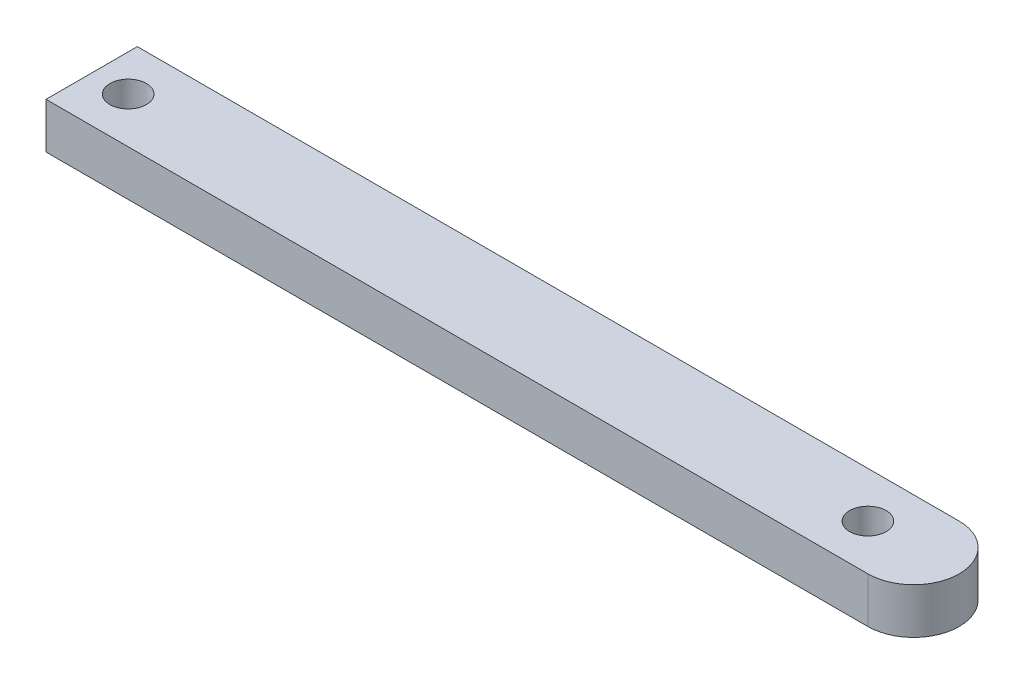
ISO-10303-21;
HEADER;
FILE_DESCRIPTION(('STEP AP214'),'2;1');
FILE_NAME('part.step','',(''),(''),'','','');
FILE_SCHEMA(('AUTOMOTIVE_DESIGN { 1 0 10303 214 1 1 1 1 }'));
ENDSEC;
DATA;
#1=APPLICATION_CONTEXT('core data for automotive mechanical design processes');
#2=APPLICATION_PROTOCOL_DEFINITION('international standard','automotive_design',2000,#1);
#3=PRODUCT_CONTEXT('',#1,'mechanical');
#4=PRODUCT('Part','Part','',(#3));
#5=PRODUCT_RELATED_PRODUCT_CATEGORY('part','',(#4));
#6=PRODUCT_DEFINITION_FORMATION('','',#4);
#7=PRODUCT_DEFINITION_CONTEXT('part definition',#1,'design');
#8=PRODUCT_DEFINITION('design','',#6,#7);
#9=PRODUCT_DEFINITION_SHAPE('','',#8);
#10=(LENGTH_UNIT() NAMED_UNIT(*) SI_UNIT(.MILLI.,.METRE.));
#11=(NAMED_UNIT(*) PLANE_ANGLE_UNIT() SI_UNIT($,.RADIAN.));
#12=(NAMED_UNIT(*) SI_UNIT($,.STERADIAN.) SOLID_ANGLE_UNIT());
#13=UNCERTAINTY_MEASURE_WITH_UNIT(LENGTH_MEASURE(1.E-05),#10,'distance_accuracy_value','');
#14=(GEOMETRIC_REPRESENTATION_CONTEXT(3) GLOBAL_UNCERTAINTY_ASSIGNED_CONTEXT((#13)) GLOBAL_UNIT_ASSIGNED_CONTEXT((#10,
#11,#12)) REPRESENTATION_CONTEXT('',''));
#15=CARTESIAN_POINT('',(0.,0.,0.));
#16=DIRECTION('',(0.,0.,1.));
#17=DIRECTION('',(1.,0.,0.));
#18=AXIS2_PLACEMENT_3D('',#15,#16,#17);
#19=CARTESIAN_POINT('',(0.,5.,-10.));
#20=DIRECTION('',(0.,0.,-1.));
#21=DIRECTION('',(-1.,0.,0.));
#22=AXIS2_PLACEMENT_3D('',#19,#20,#21);
#23=PLANE('',#22);
#24=DIRECTION('',(1.,0.,0.));
#25=VECTOR('',#24,1.);
#26=CARTESIAN_POINT('',(0.,0.,-10.));
#27=LINE('',#26,#25);
#28=CARTESIAN_POINT('',(0.,0.,-10.));
#29=VERTEX_POINT('',#28);
#30=CARTESIAN_POINT('',(90.,0.,-10.));
#31=VERTEX_POINT('',#30);
#32=EDGE_CURVE('E109',#29,#31,#27,.T.);
#33=ORIENTED_EDGE('',*,*,#32,.F.);
#34=DIRECTION('',(0.,-1.,0.));
#35=VECTOR('',#34,1.);
#36=CARTESIAN_POINT('',(0.,5.,-10.));
#37=LINE('',#36,#35);
#38=CARTESIAN_POINT('',(0.,5.,-10.));
#39=VERTEX_POINT('',#38);
#40=EDGE_CURVE('E11',#39,#29,#37,.T.);
#41=ORIENTED_EDGE('',*,*,#40,.F.);
#42=DIRECTION('',(1.,0.,0.));
#43=VECTOR('',#42,1.);
#44=CARTESIAN_POINT('',(0.,5.,-10.));
#45=LINE('',#44,#43);
#46=CARTESIAN_POINT('',(90.,5.,-10.));
#47=VERTEX_POINT('',#46);
#48=EDGE_CURVE('E96',#39,#47,#45,.T.);
#49=ORIENTED_EDGE('',*,*,#48,.T.);
#50=DIRECTION('',(0.,-1.,0.));
#51=VECTOR('',#50,1.);
#52=CARTESIAN_POINT('',(90.,5.,-10.));
#53=LINE('',#52,#51);
#54=EDGE_CURVE('E74',#47,#31,#53,.T.);
#55=ORIENTED_EDGE('',*,*,#54,.T.);
#56=EDGE_LOOP('',(#33,#41,#49,#55));
#57=FACE_BOUND('',#56,.T.);
#58=ADVANCED_FACE('F34',(#57),#23,.T.);
#59=CARTESIAN_POINT('',(0.,5.,0.));
#60=DIRECTION('',(-1.,0.,0.));
#61=DIRECTION('',(0.,0.,1.));
#62=AXIS2_PLACEMENT_3D('',#59,#60,#61);
#63=PLANE('',#62);
#64=DIRECTION('',(0.,0.,-1.));
#65=VECTOR('',#64,1.);
#66=CARTESIAN_POINT('',(0.,0.,0.));
#67=LINE('',#66,#65);
#68=CARTESIAN_POINT('',(0.,0.,0.));
#69=VERTEX_POINT('',#68);
#70=EDGE_CURVE('E86',#69,#29,#67,.T.);
#71=ORIENTED_EDGE('',*,*,#70,.F.);
#72=DIRECTION('',(0.,-1.,0.));
#73=VECTOR('',#72,1.);
#74=CARTESIAN_POINT('',(0.,5.,0.));
#75=LINE('',#74,#73);
#76=CARTESIAN_POINT('',(0.,5.,0.));
#77=VERTEX_POINT('',#76);
#78=EDGE_CURVE('E43',#77,#69,#75,.T.);
#79=ORIENTED_EDGE('',*,*,#78,.F.);
#80=DIRECTION('',(0.,0.,-1.));
#81=VECTOR('',#80,1.);
#82=CARTESIAN_POINT('',(0.,5.,0.));
#83=LINE('',#82,#81);
#84=EDGE_CURVE('E84',#77,#39,#83,.T.);
#85=ORIENTED_EDGE('',*,*,#84,.T.);
#86=ORIENTED_EDGE('',*,*,#40,.T.);
#87=EDGE_LOOP('',(#71,#79,#85,#86));
#88=FACE_BOUND('',#87,.T.);
#89=ADVANCED_FACE('F82',(#88),#63,.T.);
#90=CARTESIAN_POINT('',(0.,5.,0.));
#91=DIRECTION('',(0.,0.,-1.));
#92=DIRECTION('',(-1.,0.,0.));
#93=AXIS2_PLACEMENT_3D('',#90,#91,#92);
#94=PLANE('',#93);
#95=DIRECTION('',(1.,0.,0.));
#96=VECTOR('',#95,1.);
#97=CARTESIAN_POINT('',(0.,0.,0.));
#98=LINE('',#97,#96);
#99=CARTESIAN_POINT('',(90.,0.,0.));
#100=VERTEX_POINT('',#99);
#101=EDGE_CURVE('E112',#69,#100,#98,.T.);
#102=ORIENTED_EDGE('',*,*,#101,.T.);
#103=DIRECTION('',(0.,-1.,0.));
#104=VECTOR('',#103,1.);
#105=CARTESIAN_POINT('',(90.,5.,0.));
#106=LINE('',#105,#104);
#107=CARTESIAN_POINT('',(90.,5.,0.));
#108=VERTEX_POINT('',#107);
#109=EDGE_CURVE('E89',#108,#100,#106,.T.);
#110=ORIENTED_EDGE('',*,*,#109,.F.);
#111=DIRECTION('',(1.,0.,0.));
#112=VECTOR('',#111,1.);
#113=CARTESIAN_POINT('',(0.,5.,0.));
#114=LINE('',#113,#112);
#115=EDGE_CURVE('E91',#77,#108,#114,.T.);
#116=ORIENTED_EDGE('',*,*,#115,.F.);
#117=ORIENTED_EDGE('',*,*,#78,.T.);
#118=EDGE_LOOP('',(#102,#110,#116,#117));
#119=FACE_BOUND('',#118,.T.);
#120=ADVANCED_FACE('F92',(#119),#94,.F.);
#121=CARTESIAN_POINT('',(90.,5.,-5.));
#122=DIRECTION('',(0.,-1.,0.));
#123=DIRECTION('',(0.,0.,-1.));
#124=AXIS2_PLACEMENT_3D('',#121,#122,#123);
#125=CYLINDRICAL_SURFACE('',#124,5.);
#126=CARTESIAN_POINT('',(90.,0.,-5.));
#127=DIRECTION('',(0.,1.,0.));
#128=DIRECTION('',(0.,0.,1.));
#129=AXIS2_PLACEMENT_3D('',#126,#127,#128);
#130=CIRCLE('',#129,5.);
#131=EDGE_CURVE('E67',#100,#31,#130,.T.);
#132=ORIENTED_EDGE('',*,*,#131,.T.);
#133=ORIENTED_EDGE('',*,*,#54,.F.);
#134=CARTESIAN_POINT('',(90.,5.,-5.));
#135=DIRECTION('',(0.,1.,0.));
#136=DIRECTION('',(0.,0.,1.));
#137=AXIS2_PLACEMENT_3D('',#134,#135,#136);
#138=CIRCLE('',#137,5.);
#139=EDGE_CURVE('E51',#108,#47,#138,.T.);
#140=ORIENTED_EDGE('',*,*,#139,.F.);
#141=ORIENTED_EDGE('',*,*,#109,.T.);
#142=EDGE_LOOP('',(#132,#133,#140,#141));
#143=FACE_BOUND('',#142,.T.);
#144=ADVANCED_FACE('F120',(#143),#125,.T.);
#145=CARTESIAN_POINT('',(4.,5.,-5.));
#146=DIRECTION('',(0.,-1.,0.));
#147=DIRECTION('',(0.,0.,-1.));
#148=AXIS2_PLACEMENT_3D('',#145,#146,#147);
#149=CYLINDRICAL_SURFACE('',#148,1.99999999999999);
#150=CARTESIAN_POINT('',(4.,5.,-5.));
#151=DIRECTION('',(0.,1.,0.));
#152=DIRECTION('',(0.,0.,1.));
#153=AXIS2_PLACEMENT_3D('',#150,#151,#152);
#154=CIRCLE('',#153,1.99999999999999);
#155=CARTESIAN_POINT('',(4.,5.,-3.00000000000001));
#156=VERTEX_POINT('',#155);
#157=EDGE_CURVE('E98',#156,#156,#154,.T.);
#158=ORIENTED_EDGE('',*,*,#157,.T.);
#159=EDGE_LOOP('',(#158));
#160=FACE_BOUND('',#159,.T.);
#161=CARTESIAN_POINT('',(4.,0.,-5.));
#162=DIRECTION('',(0.,1.,0.));
#163=DIRECTION('',(0.,0.,1.));
#164=AXIS2_PLACEMENT_3D('',#161,#162,#163);
#165=CIRCLE('',#164,1.99999999999999);
#166=CARTESIAN_POINT('',(4.,0.,-3.00000000000001));
#167=VERTEX_POINT('',#166);
#168=EDGE_CURVE('E106',#167,#167,#165,.T.);
#169=ORIENTED_EDGE('',*,*,#168,.F.);
#170=EDGE_LOOP('',(#169));
#171=FACE_BOUND('',#170,.T.);
#172=ADVANCED_FACE('F36',(#160,#171),#149,.F.);
#173=CARTESIAN_POINT('',(85.,5.,-5.));
#174=DIRECTION('',(0.,-1.,0.));
#175=DIRECTION('',(0.,0.,-1.));
#176=AXIS2_PLACEMENT_3D('',#173,#174,#175);
#177=CYLINDRICAL_SURFACE('',#176,2.);
#178=CARTESIAN_POINT('',(85.,5.,-5.));
#179=DIRECTION('',(0.,1.,0.));
#180=DIRECTION('',(0.,0.,1.));
#181=AXIS2_PLACEMENT_3D('',#178,#179,#180);
#182=CIRCLE('',#181,2.);
#183=CARTESIAN_POINT('',(85.,5.,-3.));
#184=VERTEX_POINT('',#183);
#185=EDGE_CURVE('E103',#184,#184,#182,.T.);
#186=ORIENTED_EDGE('',*,*,#185,.T.);
#187=EDGE_LOOP('',(#186));
#188=FACE_BOUND('',#187,.T.);
#189=CARTESIAN_POINT('',(85.,0.,-5.));
#190=DIRECTION('',(0.,1.,0.));
#191=DIRECTION('',(0.,0.,1.));
#192=AXIS2_PLACEMENT_3D('',#189,#190,#191);
#193=CIRCLE('',#192,2.);
#194=CARTESIAN_POINT('',(85.,0.,-3.));
#195=VERTEX_POINT('',#194);
#196=EDGE_CURVE('E115',#195,#195,#193,.T.);
#197=ORIENTED_EDGE('',*,*,#196,.F.);
#198=EDGE_LOOP('',(#197));
#199=FACE_BOUND('',#198,.T.);
#200=ADVANCED_FACE('F133',(#188,#199),#177,.F.);
#201=CARTESIAN_POINT('',(0.,5.,0.));
#202=DIRECTION('',(0.,1.,0.));
#203=DIRECTION('',(0.,0.,1.));
#204=AXIS2_PLACEMENT_3D('',#201,#202,#203);
#205=PLANE('',#204);
#206=ORIENTED_EDGE('',*,*,#157,.F.);
#207=EDGE_LOOP('',(#206));
#208=FACE_BOUND('',#207,.T.);
#209=ORIENTED_EDGE('',*,*,#48,.F.);
#210=ORIENTED_EDGE('',*,*,#84,.F.);
#211=ORIENTED_EDGE('',*,*,#115,.T.);
#212=ORIENTED_EDGE('',*,*,#139,.T.);
#213=EDGE_LOOP('',(#209,#210,#211,#212));
#214=FACE_BOUND('',#213,.T.);
#215=ORIENTED_EDGE('',*,*,#185,.F.);
#216=EDGE_LOOP('',(#215));
#217=FACE_BOUND('',#216,.T.);
#218=ADVANCED_FACE('F94',(#208,#214,#217),#205,.T.);
#219=CARTESIAN_POINT('',(0.,0.,0.));
#220=DIRECTION('',(0.,1.,0.));
#221=DIRECTION('',(0.,0.,1.));
#222=AXIS2_PLACEMENT_3D('',#219,#220,#221);
#223=PLANE('',#222);
#224=ORIENTED_EDGE('',*,*,#168,.T.);
#225=EDGE_LOOP('',(#224));
#226=FACE_BOUND('',#225,.T.);
#227=ORIENTED_EDGE('',*,*,#32,.T.);
#228=ORIENTED_EDGE('',*,*,#131,.F.);
#229=ORIENTED_EDGE('',*,*,#101,.F.);
#230=ORIENTED_EDGE('',*,*,#70,.T.);
#231=EDGE_LOOP('',(#227,#228,#229,#230));
#232=FACE_BOUND('',#231,.T.);
#233=ORIENTED_EDGE('',*,*,#196,.T.);
#234=EDGE_LOOP('',(#233));
#235=FACE_BOUND('',#234,.T.);
#236=ADVANCED_FACE('F121',(#226,#232,#235),#223,.F.);
#237=CLOSED_SHELL('',(#58,#89,#120,#144,#172,#200,#218,#236));
#238=MANIFOLD_SOLID_BREP('B2',#237);
#239=ADVANCED_BREP_SHAPE_REPRESENTATION('',(#18,#238),#14);
#240=SHAPE_DEFINITION_REPRESENTATION(#9,#239);
ENDSEC;
END-ISO-10303-21;
